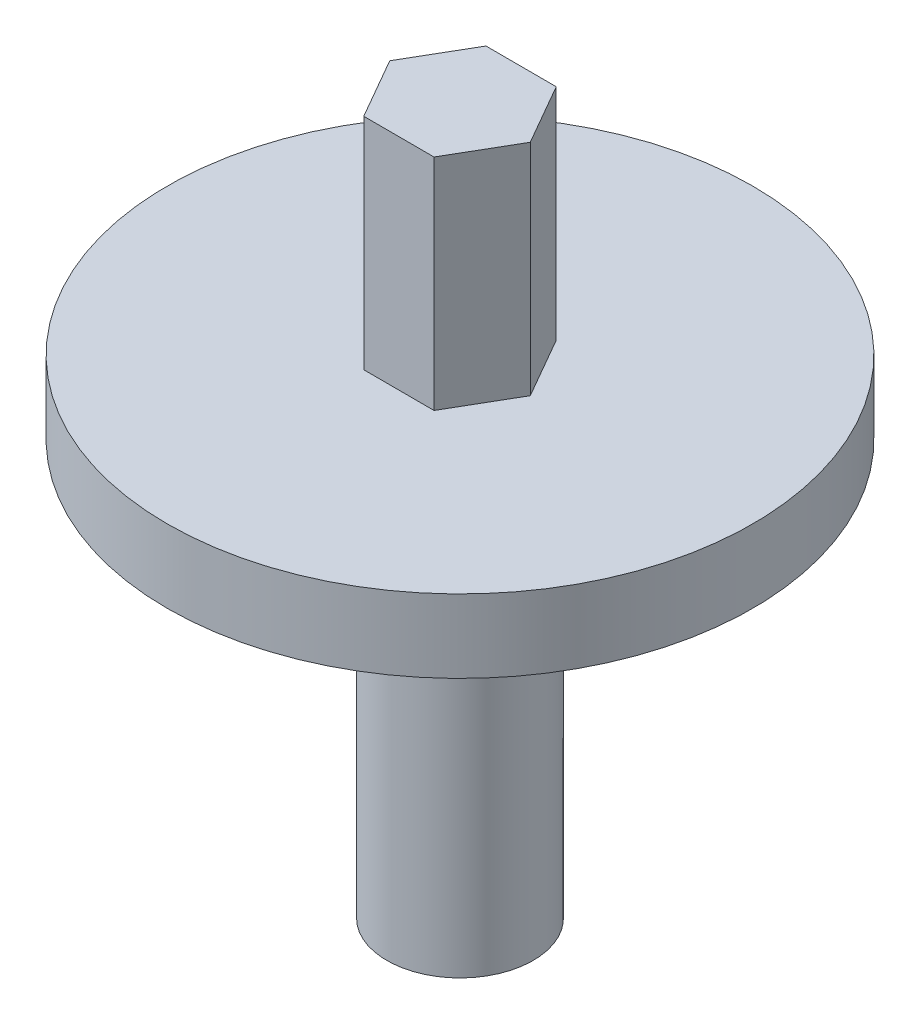
ISO-10303-21;
HEADER;
FILE_DESCRIPTION(('STEP AP214'),'2;1');
FILE_NAME('part.step','',(''),(''),'','','');
FILE_SCHEMA(('AUTOMOTIVE_DESIGN { 1 0 10303 214 1 1 1 1 }'));
ENDSEC;
DATA;
#1=APPLICATION_CONTEXT('core data for automotive mechanical design processes');
#2=APPLICATION_PROTOCOL_DEFINITION('international standard','automotive_design',2000,#1);
#3=PRODUCT_CONTEXT('',#1,'mechanical');
#4=PRODUCT('Part','Part','',(#3));
#5=PRODUCT_RELATED_PRODUCT_CATEGORY('part','',(#4));
#6=PRODUCT_DEFINITION_FORMATION('','',#4);
#7=PRODUCT_DEFINITION_CONTEXT('part definition',#1,'design');
#8=PRODUCT_DEFINITION('design','',#6,#7);
#9=PRODUCT_DEFINITION_SHAPE('','',#8);
#10=(LENGTH_UNIT() NAMED_UNIT(*) SI_UNIT(.MILLI.,.METRE.));
#11=(NAMED_UNIT(*) PLANE_ANGLE_UNIT() SI_UNIT($,.RADIAN.));
#12=(NAMED_UNIT(*) SI_UNIT($,.STERADIAN.) SOLID_ANGLE_UNIT());
#13=UNCERTAINTY_MEASURE_WITH_UNIT(LENGTH_MEASURE(1.E-05),#10,'distance_accuracy_value','');
#14=(GEOMETRIC_REPRESENTATION_CONTEXT(3) GLOBAL_UNCERTAINTY_ASSIGNED_CONTEXT((#13)) GLOBAL_UNIT_ASSIGNED_CONTEXT((#10,
#11,#12)) REPRESENTATION_CONTEXT('',''));
#15=CARTESIAN_POINT('',(0.,0.,0.));
#16=DIRECTION('',(0.,0.,1.));
#17=DIRECTION('',(1.,0.,0.));
#18=AXIS2_PLACEMENT_3D('',#15,#16,#17);
#19=CARTESIAN_POINT('',(0.,0.,0.));
#20=DIRECTION('',(0.,-1.,0.));
#21=DIRECTION('',(0.,0.,-1.));
#22=AXIS2_PLACEMENT_3D('',#19,#20,#21);
#23=PLANE('',#22);
#24=CARTESIAN_POINT('',(0.,0.,0.));
#25=DIRECTION('',(0.,-1.,0.));
#26=DIRECTION('',(0.,0.,-1.));
#27=AXIS2_PLACEMENT_3D('',#24,#25,#26);
#28=CIRCLE('',#27,3.);
#29=CARTESIAN_POINT('',(0.,0.,-3.));
#30=VERTEX_POINT('',#29);
#31=EDGE_CURVE('E11',#30,#30,#28,.T.);
#32=ORIENTED_EDGE('',*,*,#31,.T.);
#33=EDGE_LOOP('',(#32));
#34=FACE_BOUND('',#33,.T.);
#35=ADVANCED_FACE('F33',(#34),#23,.T.);
#36=CARTESIAN_POINT('',(0.,0.,0.));
#37=DIRECTION('',(0.,-1.,0.));
#38=DIRECTION('',(0.,0.,-1.));
#39=AXIS2_PLACEMENT_3D('',#36,#37,#38);
#40=CYLINDRICAL_SURFACE('',#39,3.);
#41=CARTESIAN_POINT('',(0.,17.,0.));
#42=DIRECTION('',(0.,-1.,0.));
#43=DIRECTION('',(0.,0.,-1.));
#44=AXIS2_PLACEMENT_3D('',#41,#42,#43);
#45=CIRCLE('',#44,3.);
#46=CARTESIAN_POINT('',(0.,17.,-3.));
#47=VERTEX_POINT('',#46);
#48=EDGE_CURVE('E40',#47,#47,#45,.T.);
#49=ORIENTED_EDGE('',*,*,#48,.T.);
#50=EDGE_LOOP('',(#49));
#51=FACE_BOUND('',#50,.T.);
#52=ORIENTED_EDGE('',*,*,#31,.F.);
#53=EDGE_LOOP('',(#52));
#54=FACE_BOUND('',#53,.T.);
#55=ADVANCED_FACE('F146',(#51,#54),#40,.T.);
#56=CARTESIAN_POINT('',(3.,17.,0.));
#57=DIRECTION('',(0.,-1.,0.));
#58=DIRECTION('',(0.,0.,-1.));
#59=AXIS2_PLACEMENT_3D('',#56,#57,#58);
#60=PLANE('',#59);
#61=CARTESIAN_POINT('',(0.,17.,0.));
#62=DIRECTION('',(0.,-1.,0.));
#63=DIRECTION('',(0.,0.,-1.));
#64=AXIS2_PLACEMENT_3D('',#61,#62,#63);
#65=CIRCLE('',#64,12.);
#66=CARTESIAN_POINT('',(0.,17.,-12.));
#67=VERTEX_POINT('',#66);
#68=EDGE_CURVE('E141',#67,#67,#65,.T.);
#69=ORIENTED_EDGE('',*,*,#68,.T.);
#70=EDGE_LOOP('',(#69));
#71=FACE_BOUND('',#70,.T.);
#72=ORIENTED_EDGE('',*,*,#48,.F.);
#73=EDGE_LOOP('',(#72));
#74=FACE_BOUND('',#73,.T.);
#75=ADVANCED_FACE('F149',(#71,#74),#60,.T.);
#76=CARTESIAN_POINT('',(0.,0.,0.));
#77=DIRECTION('',(0.,-1.,0.));
#78=DIRECTION('',(0.,0.,-1.));
#79=AXIS2_PLACEMENT_3D('',#76,#77,#78);
#80=CYLINDRICAL_SURFACE('',#79,12.);
#81=CARTESIAN_POINT('',(0.,20.,0.));
#82=DIRECTION('',(0.,-1.,0.));
#83=DIRECTION('',(0.,0.,-1.));
#84=AXIS2_PLACEMENT_3D('',#81,#82,#83);
#85=CIRCLE('',#84,12.);
#86=CARTESIAN_POINT('',(0.,20.,-12.));
#87=VERTEX_POINT('',#86);
#88=EDGE_CURVE('E131',#87,#87,#85,.T.);
#89=ORIENTED_EDGE('',*,*,#88,.T.);
#90=EDGE_LOOP('',(#89));
#91=FACE_BOUND('',#90,.T.);
#92=ORIENTED_EDGE('',*,*,#68,.F.);
#93=EDGE_LOOP('',(#92));
#94=FACE_BOUND('',#93,.T.);
#95=ADVANCED_FACE('F151',(#91,#94),#80,.T.);
#96=CARTESIAN_POINT('',(12.,20.,0.));
#97=DIRECTION('',(0.,1.,0.));
#98=DIRECTION('',(0.,0.,1.));
#99=AXIS2_PLACEMENT_3D('',#96,#97,#98);
#100=PLANE('',#99);
#101=ORIENTED_EDGE('',*,*,#88,.F.);
#102=EDGE_LOOP('',(#101));
#103=FACE_BOUND('',#102,.T.);
#104=DIRECTION('',(0.498124460568338,0.,0.867105542470755));
#105=VECTOR('',#104,1.);
#106=CARTESIAN_POINT('',(-2.88674458467456,20.,-0.0062478944824213));
#107=LINE('',#106,#105);
#108=CARTESIAN_POINT('',(-2.88674458467456,20.,-0.0062478944824213));
#109=VERTEX_POINT('',#108);
#110=CARTESIAN_POINT('',(-1.44878312767922,20.,2.49687019732411));
#111=VERTEX_POINT('',#110);
#112=EDGE_CURVE('E97',#109,#111,#107,.T.);
#113=ORIENTED_EDGE('',*,*,#112,.F.);
#114=DIRECTION('',(-0.501873197257791,0.,0.864941208333978));
#115=VECTOR('',#114,1.);
#116=CARTESIAN_POINT('',(-1.43796145699534,20.,-2.50311809180653));
#117=LINE('',#116,#115);
#118=CARTESIAN_POINT('',(-1.43796145699534,20.,-2.50311809180653));
#119=VERTEX_POINT('',#118);
#120=EDGE_CURVE('E117',#119,#109,#117,.T.);
#121=ORIENTED_EDGE('',*,*,#120,.F.);
#122=DIRECTION('',(-0.999997657826129,0.,-0.00216433413677659));
#123=VECTOR('',#122,1.);
#124=CARTESIAN_POINT('',(1.44878312767922,20.,-2.49687019732411));
#125=LINE('',#124,#123);
#126=CARTESIAN_POINT('',(1.44878312767922,20.,-2.49687019732411));
#127=VERTEX_POINT('',#126);
#128=EDGE_CURVE('E114',#127,#119,#125,.T.);
#129=ORIENTED_EDGE('',*,*,#128,.F.);
#130=DIRECTION('',(-0.498124460568338,0.,-0.867105542470755));
#131=VECTOR('',#130,1.);
#132=CARTESIAN_POINT('',(2.88674458467456,20.,0.00624789448242177));
#133=LINE('',#132,#131);
#134=CARTESIAN_POINT('',(2.88674458467455,20.,0.00624789448242197));
#135=VERTEX_POINT('',#134);
#136=EDGE_CURVE('E55',#135,#127,#133,.T.);
#137=ORIENTED_EDGE('',*,*,#136,.F.);
#138=DIRECTION('',(0.501873197257791,0.,-0.864941208333978));
#139=VECTOR('',#138,1.);
#140=CARTESIAN_POINT('',(1.43796145699534,20.,2.50311809180653));
#141=LINE('',#140,#139);
#142=CARTESIAN_POINT('',(1.43796145699534,20.,2.50311809180653));
#143=VERTEX_POINT('',#142);
#144=EDGE_CURVE('E89',#143,#135,#141,.T.);
#145=ORIENTED_EDGE('',*,*,#144,.F.);
#146=DIRECTION('',(0.999997657826129,0.,0.00216433413677644));
#147=VECTOR('',#146,1.);
#148=CARTESIAN_POINT('',(-1.44878312767922,20.,2.49687019732411));
#149=LINE('',#148,#147);
#150=EDGE_CURVE('E102',#111,#143,#149,.T.);
#151=ORIENTED_EDGE('',*,*,#150,.F.);
#152=EDGE_LOOP('',(#113,#121,#129,#137,#145,#151));
#153=FACE_BOUND('',#152,.T.);
#154=ADVANCED_FACE('F101',(#103,#153),#100,.T.);
#155=CARTESIAN_POINT('',(-1.44878312767922,20.,2.49687019732411));
#156=DIRECTION('',(-0.00216433413677644,0.,0.999997657826129));
#157=DIRECTION('',(0.999997657826129,0.,0.00216433413677644));
#158=AXIS2_PLACEMENT_3D('',#155,#156,#157);
#159=PLANE('',#158);
#160=DIRECTION('',(0.999997657826129,0.,0.00216433413677644));
#161=VECTOR('',#160,1.);
#162=CARTESIAN_POINT('',(-1.44878312767922,29.,2.49687019732411));
#163=LINE('',#162,#161);
#164=CARTESIAN_POINT('',(-1.44878312767922,29.,2.49687019732411));
#165=VERTEX_POINT('',#164);
#166=CARTESIAN_POINT('',(1.43796145699534,29.,2.50311809180653));
#167=VERTEX_POINT('',#166);
#168=EDGE_CURVE('E121',#165,#167,#163,.T.);
#169=ORIENTED_EDGE('',*,*,#168,.F.);
#170=DIRECTION('',(0.,1.,0.));
#171=VECTOR('',#170,1.);
#172=CARTESIAN_POINT('',(-1.44878312767922,20.,2.49687019732411));
#173=LINE('',#172,#171);
#174=EDGE_CURVE('E106',#111,#165,#173,.T.);
#175=ORIENTED_EDGE('',*,*,#174,.F.);
#176=ORIENTED_EDGE('',*,*,#150,.T.);
#177=DIRECTION('',(0.,1.,0.));
#178=VECTOR('',#177,1.);
#179=CARTESIAN_POINT('',(1.43796145699534,20.,2.50311809180653));
#180=LINE('',#179,#178);
#181=EDGE_CURVE('E87',#143,#167,#180,.T.);
#182=ORIENTED_EDGE('',*,*,#181,.T.);
#183=EDGE_LOOP('',(#169,#175,#176,#182));
#184=FACE_BOUND('',#183,.T.);
#185=ADVANCED_FACE('F105',(#184),#159,.T.);
#186=CARTESIAN_POINT('',(-2.88674458467456,20.,-0.0062478944824213));
#187=DIRECTION('',(-0.867105542470755,0.,0.498124460568338));
#188=DIRECTION('',(0.498124460568338,0.,0.867105542470755));
#189=AXIS2_PLACEMENT_3D('',#186,#187,#188);
#190=PLANE('',#189);
#191=DIRECTION('',(0.498124460568338,0.,0.867105542470755));
#192=VECTOR('',#191,1.);
#193=CARTESIAN_POINT('',(-2.88674458467456,29.,-0.0062478944824213));
#194=LINE('',#193,#192);
#195=CARTESIAN_POINT('',(-2.88674458467456,29.,-0.0062478944824213));
#196=VERTEX_POINT('',#195);
#197=EDGE_CURVE('E107',#196,#165,#194,.T.);
#198=ORIENTED_EDGE('',*,*,#197,.F.);
#199=DIRECTION('',(0.,1.,0.));
#200=VECTOR('',#199,1.);
#201=CARTESIAN_POINT('',(-2.88674458467456,20.,-0.0062478944824213));
#202=LINE('',#201,#200);
#203=EDGE_CURVE('E132',#109,#196,#202,.T.);
#204=ORIENTED_EDGE('',*,*,#203,.F.);
#205=ORIENTED_EDGE('',*,*,#112,.T.);
#206=ORIENTED_EDGE('',*,*,#174,.T.);
#207=EDGE_LOOP('',(#198,#204,#205,#206));
#208=FACE_BOUND('',#207,.T.);
#209=ADVANCED_FACE('F199',(#208),#190,.T.);
#210=CARTESIAN_POINT('',(-1.43796145699534,20.,-2.50311809180653));
#211=DIRECTION('',(-0.864941208333978,0.,-0.501873197257791));
#212=DIRECTION('',(-0.501873197257791,0.,0.864941208333978));
#213=AXIS2_PLACEMENT_3D('',#210,#211,#212);
#214=PLANE('',#213);
#215=DIRECTION('',(-0.501873197257791,0.,0.864941208333978));
#216=VECTOR('',#215,1.);
#217=CARTESIAN_POINT('',(-1.43796145699534,29.,-2.50311809180653));
#218=LINE('',#217,#216);
#219=CARTESIAN_POINT('',(-1.43796145699534,29.,-2.50311809180653));
#220=VERTEX_POINT('',#219);
#221=EDGE_CURVE('E110',#220,#196,#218,.T.);
#222=ORIENTED_EDGE('',*,*,#221,.F.);
#223=DIRECTION('',(0.,1.,0.));
#224=VECTOR('',#223,1.);
#225=CARTESIAN_POINT('',(-1.43796145699534,20.,-2.50311809180653));
#226=LINE('',#225,#224);
#227=EDGE_CURVE('E134',#119,#220,#226,.T.);
#228=ORIENTED_EDGE('',*,*,#227,.F.);
#229=ORIENTED_EDGE('',*,*,#120,.T.);
#230=ORIENTED_EDGE('',*,*,#203,.T.);
#231=EDGE_LOOP('',(#222,#228,#229,#230));
#232=FACE_BOUND('',#231,.T.);
#233=ADVANCED_FACE('F208',(#232),#214,.T.);
#234=CARTESIAN_POINT('',(1.44878312767922,20.,-2.49687019732411));
#235=DIRECTION('',(0.00216433413677659,0.,-0.999997657826129));
#236=DIRECTION('',(-0.999997657826129,0.,-0.00216433413677659));
#237=AXIS2_PLACEMENT_3D('',#234,#235,#236);
#238=PLANE('',#237);
#239=DIRECTION('',(-0.999997657826129,0.,-0.00216433413677659));
#240=VECTOR('',#239,1.);
#241=CARTESIAN_POINT('',(1.44878312767922,29.,-2.49687019732411));
#242=LINE('',#241,#240);
#243=CARTESIAN_POINT('',(1.44878312767922,29.,-2.49687019732411));
#244=VERTEX_POINT('',#243);
#245=EDGE_CURVE('E125',#244,#220,#242,.T.);
#246=ORIENTED_EDGE('',*,*,#245,.F.);
#247=DIRECTION('',(0.,1.,0.));
#248=VECTOR('',#247,1.);
#249=CARTESIAN_POINT('',(1.44878312767922,20.,-2.49687019732411));
#250=LINE('',#249,#248);
#251=EDGE_CURVE('E136',#127,#244,#250,.T.);
#252=ORIENTED_EDGE('',*,*,#251,.F.);
#253=ORIENTED_EDGE('',*,*,#128,.T.);
#254=ORIENTED_EDGE('',*,*,#227,.T.);
#255=EDGE_LOOP('',(#246,#252,#253,#254));
#256=FACE_BOUND('',#255,.T.);
#257=ADVANCED_FACE('F218',(#256),#238,.T.);
#258=CARTESIAN_POINT('',(2.88674458467456,20.,0.00624789448242177));
#259=DIRECTION('',(0.867105542470755,0.,-0.498124460568338));
#260=DIRECTION('',(-0.498124460568338,0.,-0.867105542470755));
#261=AXIS2_PLACEMENT_3D('',#258,#259,#260);
#262=PLANE('',#261);
#263=DIRECTION('',(-0.498124460568338,0.,-0.867105542470755));
#264=VECTOR('',#263,1.);
#265=CARTESIAN_POINT('',(2.88674458467456,29.,0.00624789448242177));
#266=LINE('',#265,#264);
#267=CARTESIAN_POINT('',(2.88674458467456,29.,0.00624789448242178));
#268=VERTEX_POINT('',#267);
#269=EDGE_CURVE('E47',#268,#244,#266,.T.);
#270=ORIENTED_EDGE('',*,*,#269,.F.);
#271=DIRECTION('',(0.,1.,0.));
#272=VECTOR('',#271,1.);
#273=CARTESIAN_POINT('',(2.88674458467456,20.,0.00624789448242177));
#274=LINE('',#273,#272);
#275=EDGE_CURVE('E96',#135,#268,#274,.T.);
#276=ORIENTED_EDGE('',*,*,#275,.F.);
#277=ORIENTED_EDGE('',*,*,#136,.T.);
#278=ORIENTED_EDGE('',*,*,#251,.T.);
#279=EDGE_LOOP('',(#270,#276,#277,#278));
#280=FACE_BOUND('',#279,.T.);
#281=ADVANCED_FACE('F228',(#280),#262,.T.);
#282=CARTESIAN_POINT('',(1.43796145699534,20.,2.50311809180653));
#283=DIRECTION('',(0.864941208333978,0.,0.501873197257791));
#284=DIRECTION('',(0.501873197257791,0.,-0.864941208333978));
#285=AXIS2_PLACEMENT_3D('',#282,#283,#284);
#286=PLANE('',#285);
#287=DIRECTION('',(0.501873197257791,0.,-0.864941208333978));
#288=VECTOR('',#287,1.);
#289=CARTESIAN_POINT('',(1.43796145699534,29.,2.50311809180653));
#290=LINE('',#289,#288);
#291=EDGE_CURVE('E91',#167,#268,#290,.T.);
#292=ORIENTED_EDGE('',*,*,#291,.F.);
#293=ORIENTED_EDGE('',*,*,#181,.F.);
#294=ORIENTED_EDGE('',*,*,#144,.T.);
#295=ORIENTED_EDGE('',*,*,#275,.T.);
#296=EDGE_LOOP('',(#292,#293,#294,#295));
#297=FACE_BOUND('',#296,.T.);
#298=ADVANCED_FACE('F88',(#297),#286,.T.);
#299=CARTESIAN_POINT('',(3.,29.,0.));
#300=DIRECTION('',(0.,1.,0.));
#301=DIRECTION('',(0.,0.,1.));
#302=AXIS2_PLACEMENT_3D('',#299,#300,#301);
#303=PLANE('',#302);
#304=ORIENTED_EDGE('',*,*,#197,.T.);
#305=ORIENTED_EDGE('',*,*,#168,.T.);
#306=ORIENTED_EDGE('',*,*,#291,.T.);
#307=ORIENTED_EDGE('',*,*,#269,.T.);
#308=ORIENTED_EDGE('',*,*,#245,.T.);
#309=ORIENTED_EDGE('',*,*,#221,.T.);
#310=EDGE_LOOP('',(#304,#305,#306,#307,#308,#309));
#311=FACE_BOUND('',#310,.T.);
#312=ADVANCED_FACE('F246',(#311),#303,.T.);
#313=CLOSED_SHELL('',(#35,#55,#75,#95,#154,#185,#209,#233,#257,#281,#298,#312));
#314=MANIFOLD_SOLID_BREP('B2',#313);
#315=ADVANCED_BREP_SHAPE_REPRESENTATION('',(#18,#314),#14);
#316=SHAPE_DEFINITION_REPRESENTATION(#9,#315);
ENDSEC;
END-ISO-10303-21;
